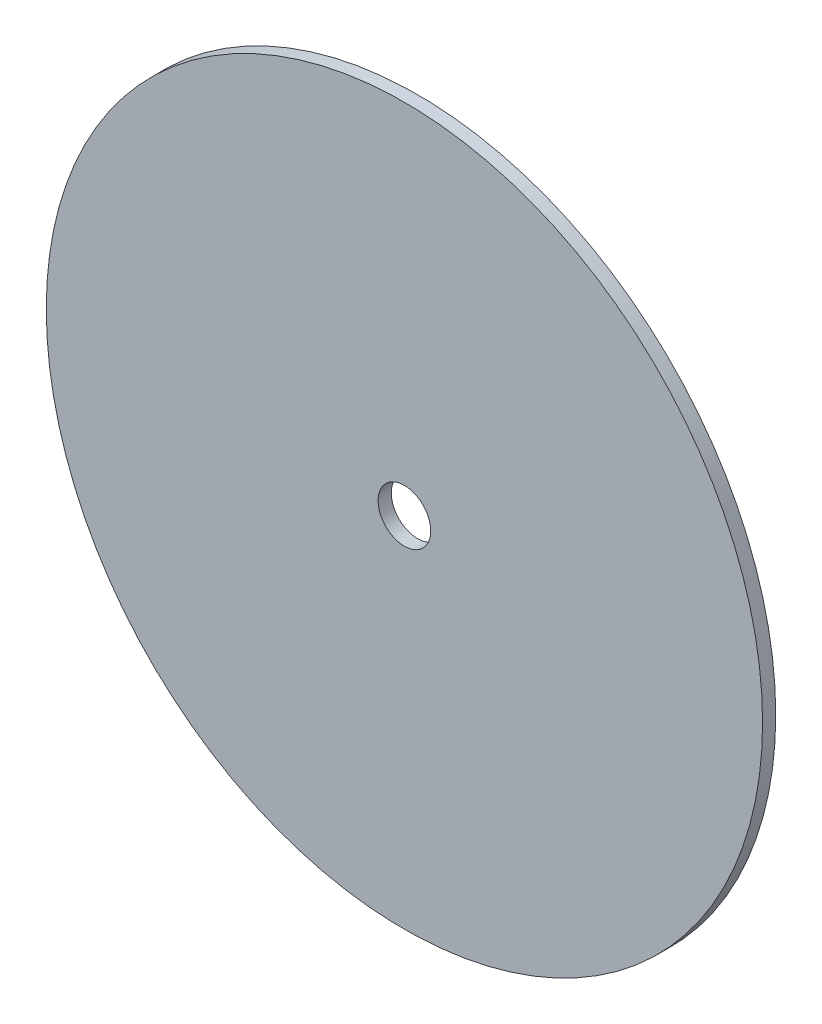
ISO-10303-21;
HEADER;
FILE_DESCRIPTION(('STEP AP214'),'2;1');
FILE_NAME('part.step','',(''),(''),'','','');
FILE_SCHEMA(('AUTOMOTIVE_DESIGN { 1 0 10303 214 1 1 1 1 }'));
ENDSEC;
DATA;
#1=APPLICATION_CONTEXT('core data for automotive mechanical design processes');
#2=APPLICATION_PROTOCOL_DEFINITION('international standard','automotive_design',2000,#1);
#3=PRODUCT_CONTEXT('',#1,'mechanical');
#4=PRODUCT('Part','Part','',(#3));
#5=PRODUCT_RELATED_PRODUCT_CATEGORY('part','',(#4));
#6=PRODUCT_DEFINITION_FORMATION('','',#4);
#7=PRODUCT_DEFINITION_CONTEXT('part definition',#1,'design');
#8=PRODUCT_DEFINITION('design','',#6,#7);
#9=PRODUCT_DEFINITION_SHAPE('','',#8);
#10=(LENGTH_UNIT() NAMED_UNIT(*) SI_UNIT(.MILLI.,.METRE.));
#11=(NAMED_UNIT(*) PLANE_ANGLE_UNIT() SI_UNIT($,.RADIAN.));
#12=(NAMED_UNIT(*) SI_UNIT($,.STERADIAN.) SOLID_ANGLE_UNIT());
#13=UNCERTAINTY_MEASURE_WITH_UNIT(LENGTH_MEASURE(1.E-05),#10,'distance_accuracy_value','');
#14=(GEOMETRIC_REPRESENTATION_CONTEXT(3) GLOBAL_UNCERTAINTY_ASSIGNED_CONTEXT((#13)) GLOBAL_UNIT_ASSIGNED_CONTEXT((#10,
#11,#12)) REPRESENTATION_CONTEXT('',''));
#15=CARTESIAN_POINT('',(0.,0.,0.));
#16=DIRECTION('',(0.,0.,1.));
#17=DIRECTION('',(1.,0.,0.));
#18=AXIS2_PLACEMENT_3D('',#15,#16,#17);
#19=CARTESIAN_POINT('',(0.,0.,1.5875));
#20=DIRECTION('',(0.,0.,1.));
#21=DIRECTION('',(1.,0.,0.));
#22=AXIS2_PLACEMENT_3D('',#19,#20,#21);
#23=PLANE('',#22);
#24=CARTESIAN_POINT('',(0.,0.,1.5875));
#25=DIRECTION('',(0.,0.,1.));
#26=DIRECTION('',(1.,0.,0.));
#27=AXIS2_PLACEMENT_3D('',#24,#25,#26);
#28=CIRCLE('',#27,43.18);
#29=CARTESIAN_POINT('',(43.18,0.,1.5875));
#30=VERTEX_POINT('',#29);
#31=EDGE_CURVE('E10',#30,#30,#28,.T.);
#32=ORIENTED_EDGE('',*,*,#31,.T.);
#33=EDGE_LOOP('',(#32));
#34=FACE_BOUND('',#33,.T.);
#35=CARTESIAN_POINT('',(0.,0.,1.5875));
#36=DIRECTION('',(0.,0.,1.));
#37=DIRECTION('',(1.,0.,0.));
#38=AXIS2_PLACEMENT_3D('',#35,#36,#37);
#39=CIRCLE('',#38,3.175);
#40=CARTESIAN_POINT('',(3.175,0.,1.5875));
#41=VERTEX_POINT('',#40);
#42=EDGE_CURVE('E50',#41,#41,#39,.T.);
#43=ORIENTED_EDGE('',*,*,#42,.F.);
#44=EDGE_LOOP('',(#43));
#45=FACE_BOUND('',#44,.T.);
#46=ADVANCED_FACE('F37',(#34,#45),#23,.T.);
#47=CARTESIAN_POINT('',(0.,0.,0.));
#48=DIRECTION('',(0.,0.,1.));
#49=DIRECTION('',(1.,0.,0.));
#50=AXIS2_PLACEMENT_3D('',#47,#48,#49);
#51=PLANE('',#50);
#52=CARTESIAN_POINT('',(0.,0.,0.));
#53=DIRECTION('',(0.,0.,1.));
#54=DIRECTION('',(1.,0.,0.));
#55=AXIS2_PLACEMENT_3D('',#52,#53,#54);
#56=CIRCLE('',#55,43.18);
#57=CARTESIAN_POINT('',(43.18,0.,0.));
#58=VERTEX_POINT('',#57);
#59=EDGE_CURVE('E41',#58,#58,#56,.T.);
#60=ORIENTED_EDGE('',*,*,#59,.F.);
#61=EDGE_LOOP('',(#60));
#62=FACE_BOUND('',#61,.T.);
#63=CARTESIAN_POINT('',(0.,0.,0.));
#64=DIRECTION('',(0.,0.,1.));
#65=DIRECTION('',(1.,0.,0.));
#66=AXIS2_PLACEMENT_3D('',#63,#64,#65);
#67=CIRCLE('',#66,3.175);
#68=CARTESIAN_POINT('',(3.175,0.,0.));
#69=VERTEX_POINT('',#68);
#70=EDGE_CURVE('E52',#69,#69,#67,.T.);
#71=ORIENTED_EDGE('',*,*,#70,.T.);
#72=EDGE_LOOP('',(#71));
#73=FACE_BOUND('',#72,.T.);
#74=ADVANCED_FACE('F64',(#62,#73),#51,.F.);
#75=CARTESIAN_POINT('',(0.,0.,1.5875));
#76=DIRECTION('',(0.,0.,-1.));
#77=DIRECTION('',(-1.,0.,0.));
#78=AXIS2_PLACEMENT_3D('',#75,#76,#77);
#79=CYLINDRICAL_SURFACE('',#78,43.18);
#80=ORIENTED_EDGE('',*,*,#31,.F.);
#81=EDGE_LOOP('',(#80));
#82=FACE_BOUND('',#81,.T.);
#83=ORIENTED_EDGE('',*,*,#59,.T.);
#84=EDGE_LOOP('',(#83));
#85=FACE_BOUND('',#84,.T.);
#86=ADVANCED_FACE('F39',(#82,#85),#79,.T.);
#87=CARTESIAN_POINT('',(0.,0.,1.5875));
#88=DIRECTION('',(0.,0.,-1.));
#89=DIRECTION('',(-1.,0.,0.));
#90=AXIS2_PLACEMENT_3D('',#87,#88,#89);
#91=CYLINDRICAL_SURFACE('',#90,3.175);
#92=ORIENTED_EDGE('',*,*,#42,.T.);
#93=EDGE_LOOP('',(#92));
#94=FACE_BOUND('',#93,.T.);
#95=ORIENTED_EDGE('',*,*,#70,.F.);
#96=EDGE_LOOP('',(#95));
#97=FACE_BOUND('',#96,.T.);
#98=ADVANCED_FACE('F60',(#94,#97),#91,.F.);
#99=CLOSED_SHELL('',(#46,#74,#86,#98));
#100=MANIFOLD_SOLID_BREP('B2',#99);
#101=ADVANCED_BREP_SHAPE_REPRESENTATION('',(#18,#100),#14);
#102=SHAPE_DEFINITION_REPRESENTATION(#9,#101);
ENDSEC;
END-ISO-10303-21;
